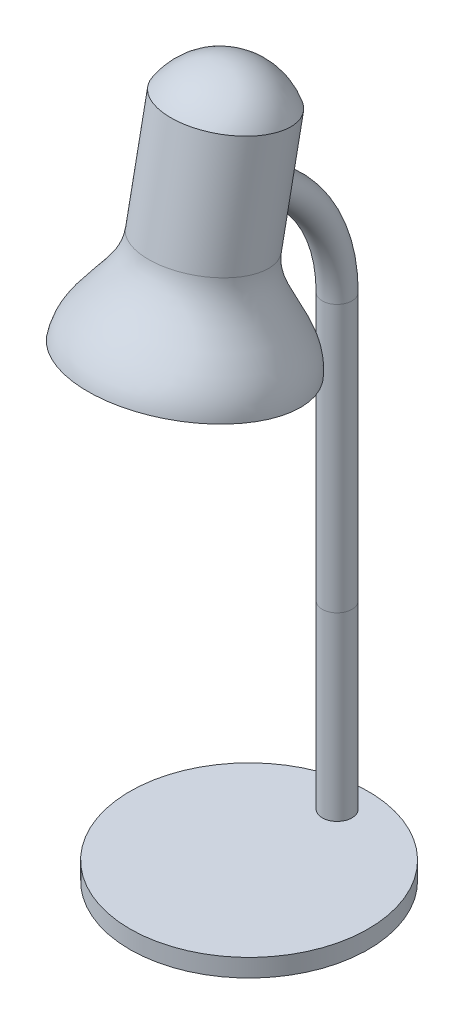
ISO-10303-21;
HEADER;
FILE_DESCRIPTION(('STEP AP214'),'2;1');
FILE_NAME('part.step','',(''),(''),'','','');
FILE_SCHEMA(('AUTOMOTIVE_DESIGN { 1 0 10303 214 1 1 1 1 }'));
ENDSEC;
DATA;
#1=APPLICATION_CONTEXT('core data for automotive mechanical design processes');
#2=APPLICATION_PROTOCOL_DEFINITION('international standard','automotive_design',2000,#1);
#3=PRODUCT_CONTEXT('',#1,'mechanical');
#4=PRODUCT('Part','Part','',(#3));
#5=PRODUCT_RELATED_PRODUCT_CATEGORY('part','',(#4));
#6=PRODUCT_DEFINITION_FORMATION('','',#4);
#7=PRODUCT_DEFINITION_CONTEXT('part definition',#1,'design');
#8=PRODUCT_DEFINITION('design','',#6,#7);
#9=PRODUCT_DEFINITION_SHAPE('','',#8);
#10=(LENGTH_UNIT() NAMED_UNIT(*) SI_UNIT(.MILLI.,.METRE.));
#11=(NAMED_UNIT(*) PLANE_ANGLE_UNIT() SI_UNIT($,.RADIAN.));
#12=(NAMED_UNIT(*) SI_UNIT($,.STERADIAN.) SOLID_ANGLE_UNIT());
#13=UNCERTAINTY_MEASURE_WITH_UNIT(LENGTH_MEASURE(1.E-05),#10,'distance_accuracy_value','');
#14=(GEOMETRIC_REPRESENTATION_CONTEXT(3) GLOBAL_UNCERTAINTY_ASSIGNED_CONTEXT((#13)) GLOBAL_UNIT_ASSIGNED_CONTEXT((#10,
#11,#12)) REPRESENTATION_CONTEXT('',''));
#15=CARTESIAN_POINT('',(0.,0.,0.));
#16=DIRECTION('',(0.,0.,1.));
#17=DIRECTION('',(1.,0.,0.));
#18=AXIS2_PLACEMENT_3D('',#15,#16,#17);
#19=CARTESIAN_POINT('',(0.,15.,0.));
#20=DIRECTION('',(0.,-1.,0.));
#21=DIRECTION('',(0.,0.,-1.));
#22=AXIS2_PLACEMENT_3D('',#19,#20,#21);
#23=CYLINDRICAL_SURFACE('',#22,100.);
#24=CARTESIAN_POINT('',(0.,15.,0.));
#25=DIRECTION('',(0.,1.,0.));
#26=DIRECTION('',(0.,0.,1.));
#27=AXIS2_PLACEMENT_3D('',#24,#25,#26);
#28=CIRCLE('',#27,100.);
#29=CARTESIAN_POINT('',(0.,15.,100.));
#30=VERTEX_POINT('',#29);
#31=EDGE_CURVE('E48',#30,#30,#28,.T.);
#32=ORIENTED_EDGE('',*,*,#31,.F.);
#33=EDGE_LOOP('',(#32));
#34=FACE_BOUND('',#33,.T.);
#35=CARTESIAN_POINT('',(0.,0.,0.));
#36=DIRECTION('',(0.,1.,0.));
#37=DIRECTION('',(0.,0.,1.));
#38=AXIS2_PLACEMENT_3D('',#35,#36,#37);
#39=CIRCLE('',#38,100.);
#40=CARTESIAN_POINT('',(0.,0.,100.));
#41=VERTEX_POINT('',#40);
#42=EDGE_CURVE('E52',#41,#41,#39,.T.);
#43=ORIENTED_EDGE('',*,*,#42,.T.);
#44=EDGE_LOOP('',(#43));
#45=FACE_BOUND('',#44,.T.);
#46=ADVANCED_FACE('F33',(#34,#45),#23,.T.);
#47=CARTESIAN_POINT('',(0.,15.,0.));
#48=DIRECTION('',(0.,1.,0.));
#49=DIRECTION('',(0.,0.,1.));
#50=AXIS2_PLACEMENT_3D('',#47,#48,#49);
#51=PLANE('',#50);
#52=CARTESIAN_POINT('',(0.,15.,-73.9027690208939));
#53=DIRECTION('',(0.,1.,0.));
#54=DIRECTION('',(0.,0.,1.));
#55=AXIS2_PLACEMENT_3D('',#52,#53,#54);
#56=CIRCLE('',#55,12.5);
#57=CARTESIAN_POINT('',(0.,15.,-61.4027690208939));
#58=VERTEX_POINT('',#57);
#59=EDGE_CURVE('E44',#58,#58,#56,.T.);
#60=ORIENTED_EDGE('',*,*,#59,.F.);
#61=EDGE_LOOP('',(#60));
#62=FACE_BOUND('',#61,.T.);
#63=ORIENTED_EDGE('',*,*,#31,.T.);
#64=EDGE_LOOP('',(#63));
#65=FACE_BOUND('',#64,.T.);
#66=ADVANCED_FACE('F107',(#62,#65),#51,.T.);
#67=CARTESIAN_POINT('',(0.,0.,0.));
#68=DIRECTION('',(0.,1.,0.));
#69=DIRECTION('',(0.,0.,1.));
#70=AXIS2_PLACEMENT_3D('',#67,#68,#69);
#71=PLANE('',#70);
#72=ORIENTED_EDGE('',*,*,#42,.F.);
#73=EDGE_LOOP('',(#72));
#74=FACE_BOUND('',#73,.T.);
#75=ADVANCED_FACE('F99',(#74),#71,.F.);
#76=CARTESIAN_POINT('',(0.,15.,-73.9027690208939));
#77=DIRECTION('',(0.,1.,0.));
#78=DIRECTION('',(0.,0.,1.));
#79=AXIS2_PLACEMENT_3D('',#76,#77,#78);
#80=CYLINDRICAL_SURFACE('',#79,12.5);
#81=CARTESIAN_POINT('',(0.,166.562691704153,-73.9027690208939));
#82=DIRECTION('',(0.,1.,0.));
#83=DIRECTION('',(0.,0.,1.));
#84=AXIS2_PLACEMENT_3D('',#81,#82,#83);
#85=CIRCLE('',#84,12.5);
#86=CARTESIAN_POINT('',(0.,166.562691704153,-61.4027690208939));
#87=VERTEX_POINT('',#86);
#88=EDGE_CURVE('E60',#87,#87,#85,.T.);
#89=ORIENTED_EDGE('',*,*,#88,.F.);
#90=EDGE_LOOP('',(#89));
#91=FACE_BOUND('',#90,.T.);
#92=ORIENTED_EDGE('',*,*,#59,.T.);
#93=EDGE_LOOP('',(#92));
#94=FACE_BOUND('',#93,.T.);
#95=ADVANCED_FACE('F95',(#91,#94),#80,.T.);
#96=CARTESIAN_POINT('',(0.,166.562691704153,-73.9027690208939));
#97=DIRECTION('',(0.,1.,0.));
#98=DIRECTION('',(0.,0.,1.));
#99=AXIS2_PLACEMENT_3D('',#96,#97,#98);
#100=CYLINDRICAL_SURFACE('',#99,12.5);
#101=CARTESIAN_POINT('',(0.,390.709968379415,-73.9027690208939));
#102=DIRECTION('',(0.,1.,0.));
#103=DIRECTION('',(0.,0.,1.));
#104=AXIS2_PLACEMENT_3D('',#101,#102,#103);
#105=CIRCLE('',#104,12.5);
#106=CARTESIAN_POINT('',(0.,390.709968379415,-61.4027690208939));
#107=VERTEX_POINT('',#106);
#108=EDGE_CURVE('E56',#107,#107,#105,.T.);
#109=ORIENTED_EDGE('',*,*,#108,.F.);
#110=EDGE_LOOP('',(#109));
#111=FACE_BOUND('',#110,.T.);
#112=ORIENTED_EDGE('',*,*,#88,.T.);
#113=EDGE_LOOP('',(#112));
#114=FACE_BOUND('',#113,.T.);
#115=ADVANCED_FACE('F98',(#111,#114),#100,.T.);
#116=CARTESIAN_POINT('',(0.,390.709968379415,57.1366035587014));
#117=DIRECTION('',(1.,0.,0.));
#118=DIRECTION('',(0.,0.,-1.));
#119=AXIS2_PLACEMENT_3D('',#116,#117,#118);
#120=TOROIDAL_SURFACE('',#119,131.039372579595,12.5);
#121=CARTESIAN_POINT('',(-8.06286595516028,491.884865811808,-10.1153728452763));
#122=CARTESIAN_POINT('',(-7.82251858395911,491.644673783526,-10.1102305875531));
#123=CARTESIAN_POINT('',(-7.57347286892825,491.413194516873,-10.1064060775136));
#124=CARTESIAN_POINT('',(-7.05858234655378,490.969705131541,-10.1008619291891));
#125=CARTESIAN_POINT('',(-6.79273968247136,490.757692537384,-10.0991420229283));
#126=CARTESIAN_POINT('',(-6.24515947260742,490.355448830147,-10.0972849643039));
#127=CARTESIAN_POINT('',(-5.96342748797326,490.165210166105,-10.0971472615926));
#128=CARTESIAN_POINT('',(-5.38519148883697,489.808887553874,-10.0979456229405));
#129=CARTESIAN_POINT('',(-5.08869333274936,489.642794127065,-10.0988812643508));
#130=CARTESIAN_POINT('',(-4.47977934640309,489.335861919405,-10.1013553208368));
#131=CARTESIAN_POINT('',(-4.16725226870532,489.195243065975,-10.1028986508163));
#132=CARTESIAN_POINT('',(-3.53052195955629,488.943411597388,-10.1061391698337));
#133=CARTESIAN_POINT('',(-3.20631871064483,488.832199026205,-10.1078363591017));
#134=CARTESIAN_POINT('',(-2.5489575201936,488.641455704321,-10.1110013078322));
#135=CARTESIAN_POINT('',(-2.21580665784297,488.561900651701,-10.1124692427538));
#136=CARTESIAN_POINT('',(-1.54327574852851,488.43610362684,-10.1148863113329));
#137=CARTESIAN_POINT('',(-1.20389655841725,488.389857106942,-10.1158355158089));
#138=CARTESIAN_POINT('',(-0.56085539304836,488.335030527843,-10.1169722864157));
#139=CARTESIAN_POINT('',(-0.257502017136687,488.32277732143,-10.1172339452288));
#140=CARTESIAN_POINT('',(0.349067552791181,488.325517741268,-10.1171759319876));
#141=CARTESIAN_POINT('',(0.652283756082344,488.340509112804,-10.1168563080392));
#142=CARTESIAN_POINT('',(1.25613849325264,488.397450804496,-10.1156813150253));
#143=CARTESIAN_POINT('',(1.55677720428459,488.439399256574,-10.1148259830833));
#144=CARTESIAN_POINT('',(2.15320883165123,488.549482223702,-10.1127051097686));
#145=CARTESIAN_POINT('',(2.44900172956875,488.61761683825,-10.1114395668371));
#146=CARTESIAN_POINT('',(3.01874602812975,488.774773290116,-10.10876481444));
#147=CARTESIAN_POINT('',(3.29304206638072,488.862552923617,-10.1073662210712));
#148=CARTESIAN_POINT('',(3.83397150244333,489.059403901236,-10.1045926620874));
#149=CARTESIAN_POINT('',(4.10060228342257,489.168482419812,-10.1032177046044));
#150=CARTESIAN_POINT('',(4.6247658239474,489.406474033615,-10.1007453724047));
#151=CARTESIAN_POINT('',(4.88230059632872,489.535382706428,-10.0996479359406));
#152=CARTESIAN_POINT('',(5.38740529513325,489.811624670263,-10.0980098602242));
#153=CARTESIAN_POINT('',(5.63497093766401,489.958965772629,-10.0974694579356));
#154=CARTESIAN_POINT('',(6.14536072629467,490.287374300899,-10.0972329571732));
#155=CARTESIAN_POINT('',(6.40694729188403,490.470365477863,-10.0976342937663));
#156=CARTESIAN_POINT('',(6.91591163173312,490.855146228167,-10.0999111740939));
#157=CARTESIAN_POINT('',(7.16328729434347,491.056938583621,-10.1017869363136));
#158=CARTESIAN_POINT('',(7.64324854057016,491.477553824049,-10.107448824403));
#159=CARTESIAN_POINT('',(7.87582877143556,491.696382809643,-10.1112356372838));
#160=CARTESIAN_POINT('',(8.32554491088291,492.149229809153,-10.121153348038));
#161=CARTESIAN_POINT('',(8.5426790678052,492.383249540036,-10.1272845112709));
#162=CARTESIAN_POINT('',(9.24487587943709,493.191685021346,-10.1525556993549));
#163=CARTESIAN_POINT('',(9.69437992067384,493.797728145554,-10.1780664604019));
#164=CARTESIAN_POINT('',(10.2984099259682,494.749348473771,-10.2321552800942));
#165=CARTESIAN_POINT('',(10.488158038744,495.073892090379,-10.2528422092834));
#166=CARTESIAN_POINT('',(10.8437763122377,495.735535955312,-10.3001882799431));
#167=CARTESIAN_POINT('',(11.0096454243975,496.072636754221,-10.3268476835413));
#168=CARTESIAN_POINT('',(11.336496172225,496.801573496239,-10.3906514062751));
#169=CARTESIAN_POINT('',(11.4940791628164,497.19485520915,-10.4287052393503));
#170=CARTESIAN_POINT('',(11.7765132405789,497.992029931605,-10.5140751622455));
#171=CARTESIAN_POINT('',(11.9013648979819,498.395922756153,-10.5613910906799));
#172=CARTESIAN_POINT('',(12.1169970473184,499.211523475409,-10.6659781974343));
#173=CARTESIAN_POINT('',(12.2077730593908,499.623232390216,-10.7232506832771));
#174=CARTESIAN_POINT('',(12.3537884735713,500.451355251982,-10.8482164509498));
#175=CARTESIAN_POINT('',(12.409029709534,500.867768955012,-10.9159091947947));
#176=CARTESIAN_POINT('',(12.4820622893767,501.696499612024,-11.0609294552682));
#177=CARTESIAN_POINT('',(12.5003402759665,502.108797716245,-11.1381173855853));
#178=CARTESIAN_POINT('',(12.49965018068,502.931379263285,-11.302636349525));
#179=CARTESIAN_POINT('',(12.4806816737611,503.341662683059,-11.3899674988874));
#180=CARTESIAN_POINT('',(12.4045236698766,504.156240634753,-11.5740971060575));
#181=CARTESIAN_POINT('',(12.347361348361,504.560539216056,-11.6708887907841));
#182=CARTESIAN_POINT('',(12.1942357242208,505.359564987831,-11.872905706533));
#183=CARTESIAN_POINT('',(12.098277292256,505.754293373203,-11.9781298775692));
#184=CARTESIAN_POINT('',(11.8796438849992,506.489399873884,-12.1839932677568));
#185=CARTESIAN_POINT('',(11.7608435491044,506.831125887437,-12.2839495239686));
#186=CARTESIAN_POINT('',(11.4924735252476,507.501016304537,-12.487914593084));
#187=CARTESIAN_POINT('',(11.3429060059247,507.829181661954,-12.5919231199429));
#188=CARTESIAN_POINT('',(11.0137957992173,508.469211382766,-12.8022765899787));
#189=CARTESIAN_POINT('',(10.8342614563194,508.781080252384,-12.9086208756072));
#190=CARTESIAN_POINT('',(10.4463375086757,509.386147329445,-13.1217907943032));
#191=CARTESIAN_POINT('',(10.237948994953,509.679346242217,-13.2286164090232));
#192=CARTESIAN_POINT('',(9.80952469633271,510.224884674376,-13.4332530455989));
#193=CARTESIAN_POINT('',(9.59134745438112,510.478647489046,-13.5311684003521));
#194=CARTESIAN_POINT('',(9.13287170324552,510.966540727402,-13.7240288984553));
#195=CARTESIAN_POINT('',(8.89257443667849,511.200672252486,-13.8189742082497));
#196=CARTESIAN_POINT('',(8.39155519754505,511.647922448715,-14.0042550718624));
#197=CARTESIAN_POINT('',(8.13083456786525,511.86104249934,-14.0945909281197));
#198=CARTESIAN_POINT('',(7.59080962359129,512.265119550284,-14.2690835130365));
#199=CARTESIAN_POINT('',(7.31150510011805,512.456076301426,-14.3532401722209));
#200=CARTESIAN_POINT('',(6.7386416919226,512.813389894788,-14.5132440878495));
#201=CARTESIAN_POINT('',(6.4452159755779,512.979932760301,-14.5891529004733));
#202=CARTESIAN_POINT('',(5.84412492713943,513.289443444743,-14.7321149251048));
#203=CARTESIAN_POINT('',(5.53645974280794,513.432411508237,-14.7991682289778));
#204=CARTESIAN_POINT('',(4.90903675078429,513.694132286176,-14.9232573278166));
#205=CARTESIAN_POINT('',(4.58927855784782,513.812884228403,-14.9802928033195));
#206=CARTESIAN_POINT('',(3.93990975463835,514.025655902871,-15.0833540291292));
#207=CARTESIAN_POINT('',(3.61029904822713,514.119675393691,-15.1293796719656));
#208=CARTESIAN_POINT('',(2.94018418271357,514.283404672064,-15.2100232803066));
#209=CARTESIAN_POINT('',(2.59960408473761,514.352862171071,-15.2445226655304));
#210=CARTESIAN_POINT('',(1.91313862975715,514.465861776306,-15.300865197467));
#211=CARTESIAN_POINT('',(1.56725324189056,514.509403731719,-15.3227082705265));
#212=CARTESIAN_POINT('',(0.872605774087641,514.570396819252,-15.3533526317651));
#213=CARTESIAN_POINT('',(0.523843609444751,514.58784718033,-15.3621535345298));
#214=CARTESIAN_POINT('',(-0.174091549811828,514.596584759729,-15.3665568990211));
#215=CARTESIAN_POINT('',(-0.523264545077464,514.587871936476,-15.3621593397748));
#216=CARTESIAN_POINT('',(-1.22116474482659,514.544217578745,-15.3401928406112));
#217=CARTESIAN_POINT('',(-1.56988252870068,514.509155709066,-15.3225634719359));
#218=CARTESIAN_POINT('',(-2.26277347404677,514.412804895727,-15.2743769367745));
#219=CARTESIAN_POINT('',(-2.60694661693562,514.351515844858,-15.243819717443));
#220=CARTESIAN_POINT('',(-3.28830144661685,514.202962308561,-15.1703218762867));
#221=CARTESIAN_POINT('',(-3.62548300219483,514.115697336103,-15.1273810222773));
#222=CARTESIAN_POINT('',(-4.2904368503879,513.915562046782,-15.0298828000955));
#223=CARTESIAN_POINT('',(-4.61820916117409,513.802691779372,-14.9753254543584));
#224=CARTESIAN_POINT('',(-5.26174277195647,513.551937846912,-14.8556154266374));
#225=CARTESIAN_POINT('',(-5.57751315598528,513.414073574534,-14.7904709631544));
#226=CARTESIAN_POINT('',(-6.19503499100803,513.113904520481,-14.6507198698924));
#227=CARTESIAN_POINT('',(-6.49678643856588,512.951599732815,-14.5761132377942));
#228=CARTESIAN_POINT('',(-7.08407044063949,512.603342774736,-14.4187737454177));
#229=CARTESIAN_POINT('',(-7.36960383584014,512.417391831675,-14.3360413069594));
#230=CARTESIAN_POINT('',(-7.92239564848987,512.022790645047,-14.1639208408252));
#231=CARTESIAN_POINT('',(-8.18965420382025,511.814140572774,-14.0745328633751));
#232=CARTESIAN_POINT('',(-8.70211933464038,511.376857722931,-13.8913439237227));
#233=CARTESIAN_POINT('',(-8.9474703218853,511.148378996415,-13.7975792100021));
#234=CARTESIAN_POINT('',(-9.41652881124871,510.67148758047,-13.6066678580171));
#235=CARTESIAN_POINT('',(-9.6402364591904,510.423075025367,-13.5095212425444));
#236=CARTESIAN_POINT('',(-10.0644525431539,509.907871255821,-13.3135027888319));
#237=CARTESIAN_POINT('',(-10.2649642633108,509.641082651658,-13.2146311971053));
#238=CARTESIAN_POINT('',(-10.6415327492197,509.090816868801,-13.0167686883811));
#239=CARTESIAN_POINT('',(-10.8175896572721,508.807339787229,-12.9177777720814));
#240=CARTESIAN_POINT('',(-11.1428526893394,508.228046770823,-12.7220461064674));
#241=CARTESIAN_POINT('',(-11.2922717165263,507.932354326471,-12.6252934459841));
#242=CARTESIAN_POINT('',(-11.5653383582457,507.328448004761,-12.4345745513783));
#243=CARTESIAN_POINT('',(-11.6889862318082,507.020234253294,-12.3406082892573));
#244=CARTESIAN_POINT('',(-11.9100901725008,506.393390584266,-12.1566794814346));
#245=CARTESIAN_POINT('',(-12.0075452862824,506.074760288043,-12.0667170815625));
#246=CARTESIAN_POINT('',(-12.1761205153395,505.42926713653,-11.8918229561532));
#247=CARTESIAN_POINT('',(-12.2472400890741,505.102404112097,-11.8068913340945));
#248=CARTESIAN_POINT('',(-12.3645648546023,504.435251181699,-11.6410333567091));
#249=CARTESIAN_POINT('',(-12.410177562416,504.094824465502,-11.5602389781525));
#250=CARTESIAN_POINT('',(-12.4743859435071,503.409934968705,-11.405375634994));
#251=CARTESIAN_POINT('',(-12.4929813644553,503.06547215044,-11.3313067332111));
#252=CARTESIAN_POINT('',(-12.5037326225034,502.374714305456,-11.1902805799226));
#253=CARTESIAN_POINT('',(-12.4958895298888,502.028419353473,-11.1233230406477));
#254=CARTESIAN_POINT('',(-12.4544759316789,501.335934056185,-10.9966603057867));
#255=CARTESIAN_POINT('',(-12.420896020885,500.989743795415,-10.9369577706938));
#256=CARTESIAN_POINT('',(-12.3251228204573,500.272025794271,-10.8203427596575));
#257=CARTESIAN_POINT('',(-12.2608639222976,499.900675669214,-10.7640310542884));
#258=CARTESIAN_POINT('',(-12.1042780179867,499.162623592866,-10.6596155679528));
#259=CARTESIAN_POINT('',(-12.0119386504016,498.795923762911,-10.6115154164225));
#260=CARTESIAN_POINT('',(-11.8001345496997,498.069172993501,-10.5231159471992));
#261=CARTESIAN_POINT('',(-11.6806484079684,497.709127545496,-10.4828228330464));
#262=CARTESIAN_POINT('',(-11.4155444920775,496.99801505502,-10.4095583299658));
#263=CARTESIAN_POINT('',(-11.2699245021785,496.646948776726,-10.3765875623886));
#264=CARTESIAN_POINT('',(-10.9248094761927,495.893341608821,-10.3120064989437));
#265=CARTESIAN_POINT('',(-10.7203341667788,495.492956920351,-10.2817176450559));
#266=CARTESIAN_POINT('',(-10.2773780186416,494.710792360587,-10.2293847935646));
#267=CARTESIAN_POINT('',(-10.0388899983517,494.329016441317,-10.2073425407487));
#268=CARTESIAN_POINT('',(-9.52924652835326,493.587975812017,-10.1703428725563));
#269=CARTESIAN_POINT('',(-9.25811661836342,493.228693832547,-10.1553799627637));
#270=CARTESIAN_POINT('',(-8.68403059328395,492.536137629014,-10.1312987047912));
#271=CARTESIAN_POINT('',(-8.38107158344011,492.2028657753,-10.1221808887403));
#272=CARTESIAN_POINT('',(-8.06286595516028,491.884865811808,-10.1153728452763));
#273=B_SPLINE_CURVE_WITH_KNOTS('',3,(#121,#122,#123,#124,#125,#126,#127,#128,#129,#130,#131,
#132,#133,#134,#135,#136,#137,#138,#139,#140,#141,#142,#143,#144,#145,#146,#147,#148,#149,#150,
#151,#152,#153,#154,#155,#156,#157,#158,#159,#160,#161,#162,#163,#164,#165,#166,#167,#168,#169,
#170,#171,#172,#173,#174,#175,#176,#177,#178,#179,#180,#181,#182,#183,#184,#185,#186,#187,#188,
#189,#190,#191,#192,#193,#194,#195,#196,#197,#198,#199,#200,#201,#202,#203,#204,#205,#206,#207,
#208,#209,#210,#211,#212,#213,#214,#215,#216,#217,#218,#219,#220,#221,#222,#223,#224,#225,#226,
#227,#228,#229,#230,#231,#232,#233,#234,#235,#236,#237,#238,#239,#240,#241,#242,#243,#244,#245,
#246,#247,#248,#249,#250,#251,#252,#253,#254,#255,#256,#257,#258,#259,#260,#261,#262,#263,#264,
#265,#266,#267,#268,#269,#270,#271,#272),.UNSPECIFIED.,.T.,.F.,(4,2,2,2,2,2,2,2,2,2,2,2,2,2,2,2,
2,2,2,2,2,2,2,2,2,2,2,2,2,2,2,2,2,2,2,2,2,2,2,2,2,2,2,2,2,2,2,2,2,2,2,2,2,2,2,2,2,2,2,2,2,2,2,2,
2,2,2,2,2,2,2,2,2,2,2,4),(0.,1.01920317946577,2.03827657200454,3.05699548329258,
4.07531339302406,5.10204231372148,6.12877276982189,7.15471352799182,8.18051418656514,
9.09012186293512,9.99965426510828,10.9091236451117,11.8185964808768,12.6816947842758,
13.5450843225576,14.4082815907228,15.2718459140103,16.2286275605183,17.1855510128632,
18.1428187187165,19.1001948108727,21.3546302469976,22.4834432465172,23.6123057985773,
24.8869793179615,26.1616306290232,27.4364494574543,28.7112024906256,29.9690604435243,
31.2269327506943,32.483911015287,33.7407315214581,34.8652786965634,35.9897466345799,
37.1139019768413,38.2380148245621,39.2828320459274,40.3275906093006,41.3722805347841,
42.4169822043475,43.4532561381574,44.4895193210132,45.5258155437316,46.5621218816574,
47.6087829560155,48.6554501213503,49.7021482165549,50.7488479750087,51.800357248227,
52.8518708197596,53.9034041077125,54.9549353648123,56.0056542110127,57.0563733147473,
58.1070379032225,59.157694563695,60.2008157940593,61.2439299958466,62.2868963298008,
63.3298565945671,64.3640656323269,65.3982642745849,66.4325005538954,67.4667580991557,
68.524135781485,69.5815233391796,70.6388680921586,71.696599422908,72.8385603211213,
73.9810246567529,75.1243931146805,76.2678585581162,77.6178643950177,78.9681557001962,
80.3173972918322,81.6667616990479),.UNSPECIFIED.);
#274=CARTESIAN_POINT('',(-8.06286595516028,491.884865811808,-10.1153728452763));
#275=VERTEX_POINT('',#274);
#276=EDGE_CURVE('E10',#275,#275,#273,.T.);
#277=ORIENTED_EDGE('',*,*,#276,.F.);
#278=EDGE_LOOP('',(#277));
#279=FACE_BOUND('',#278,.T.);
#280=ORIENTED_EDGE('',*,*,#108,.T.);
#281=EDGE_LOOP('',(#280));
#282=FACE_BOUND('',#281,.T.);
#283=ADVANCED_FACE('F93',(#279,#282),#120,.T.);
#284=CARTESIAN_POINT('',(83.0591746575059,406.940879043471,53.8942234902052));
#285=DIRECTION('',(0.,-0.980624825769608,0.19589525539003));
#286=DIRECTION('',(0.,-0.19589525539003,-0.980624825769608));
#287=AXIS2_PLACEMENT_3D('',#284,#285,#286);
#288=PLANE('',#287);
#289=CARTESIAN_POINT('',(0.,406.940879043471,53.8942234902052));
#290=DIRECTION('',(0.,-0.980624825769608,0.19589525539003));
#291=DIRECTION('',(0.,-0.19589525539003,-0.980624825769608));
#292=AXIS2_PLACEMENT_3D('',#289,#290,#291);
#293=CIRCLE('',#292,83.0591746575059);
#294=CARTESIAN_POINT('',(0.,390.669980811454,-27.5556651868791));
#295=VERTEX_POINT('',#294);
#296=EDGE_CURVE('E69',#295,#295,#293,.T.);
#297=ORIENTED_EDGE('',*,*,#296,.T.);
#298=EDGE_LOOP('',(#297));
#299=FACE_BOUND('',#298,.T.);
#300=ADVANCED_FACE('F89',(#299),#288,.T.);
#301=CARTESIAN_POINT('',(0.,554.460254823741,24.4249045070009));
#302=DIRECTION('',(0.,-0.980624825769608,0.19589525539003));
#303=DIRECTION('',(1.,0.,0.));
#304=AXIS2_PLACEMENT_3D('',#301,#302,#303);
#305=SPHERICAL_SURFACE('',#304,52.6660549935419);
#306=CARTESIAN_POINT('',(0.,578.092977513332,19.703895895776));
#307=DIRECTION('',(0.,-0.980624825769608,0.19589525539003));
#308=DIRECTION('',(0.,-0.19589525539003,-0.980624825769608));
#309=AXIS2_PLACEMENT_3D('',#306,#307,#308);
#310=CIRCLE('',#309,46.8286220654889);
#311=CARTESIAN_POINT('',(0.,568.91947263425,-26.2174134582249));
#312=VERTEX_POINT('',#311);
#313=EDGE_CURVE('E63',#312,#312,#310,.T.);
#314=ORIENTED_EDGE('',*,*,#313,.F.);
#315=EDGE_LOOP('',(#314));
#316=FACE_BOUND('',#315,.T.);
#317=ADVANCED_FACE('F86',(#316),#305,.T.);
#318=CARTESIAN_POINT('',(0.,406.940879043471,53.8942234902052));
#319=DIRECTION('',(0.,-0.980624825769608,0.19589525539003));
#320=DIRECTION('',(0.,-0.19589525539003,-0.980624825769608));
#321=AXIS2_PLACEMENT_3D('',#318,#319,#320);
#322=CYLINDRICAL_SURFACE('',#321,46.8286220654888);
#323=ORIENTED_EDGE('',*,*,#276,.T.);
#324=EDGE_LOOP('',(#323));
#325=FACE_BOUND('',#324,.T.);
#326=ORIENTED_EDGE('',*,*,#313,.T.);
#327=EDGE_LOOP('',(#326));
#328=FACE_BOUND('',#327,.T.);
#329=CARTESIAN_POINT('',(0.,484.488835835217,38.4027976140841));
#330=DIRECTION('',(0.,-0.980624825769608,0.19589525539003));
#331=DIRECTION('',(0.,-0.19589525539003,-0.980624825769608));
#332=AXIS2_PLACEMENT_3D('',#329,#330,#331);
#333=CIRCLE('',#332,46.8286220654888);
#334=CARTESIAN_POINT('',(0.,475.315330956135,-7.51851173991668));
#335=VERTEX_POINT('',#334);
#336=EDGE_CURVE('E66',#335,#335,#333,.T.);
#337=ORIENTED_EDGE('',*,*,#336,.F.);
#338=EDGE_LOOP('',(#337));
#339=FACE_BOUND('',#338,.T.);
#340=ADVANCED_FACE('F81',(#325,#328,#339),#322,.T.);
#341=CARTESIAN_POINT('',(83.0591746575059,406.940879043471,53.8942234902052));
#342=CARTESIAN_POINT('',(81.2296843134483,438.054100969985,47.678867326325));
#343=CARTESIAN_POINT('',(47.0769369166204,452.84588008035,44.7239764543509));
#344=CARTESIAN_POINT('',(46.8286220654888,484.488835835217,38.4027976140841));
#345=B_SPLINE_CURVE_WITH_KNOTS('',3,(#341,#342,#343,#344),.UNSPECIFIED.,.F.,.F.,(4,4),(0.,1.),.UNSPECIFIED.);
#346=CARTESIAN_POINT('',(0.,406.940879043471,53.8942234902052));
#347=DIRECTION('',(0.,-0.980624825769608,0.19589525539003));
#348=AXIS1_PLACEMENT('',#346,#347);
#349=SURFACE_OF_REVOLUTION('',#345,#348);
#350=ORIENTED_EDGE('',*,*,#336,.T.);
#351=EDGE_LOOP('',(#350));
#352=FACE_BOUND('',#351,.T.);
#353=ORIENTED_EDGE('',*,*,#296,.F.);
#354=EDGE_LOOP('',(#353));
#355=FACE_BOUND('',#354,.T.);
#356=ADVANCED_FACE('F79',(#352,#355),#349,.F.);
#357=CLOSED_SHELL('',(#46,#66,#75,#95,#115,#283,#300,#317,#340,#356));
#358=MANIFOLD_SOLID_BREP('B2',#357);
#359=ADVANCED_BREP_SHAPE_REPRESENTATION('',(#18,#358),#14);
#360=SHAPE_DEFINITION_REPRESENTATION(#9,#359);
ENDSEC;
END-ISO-10303-21;
